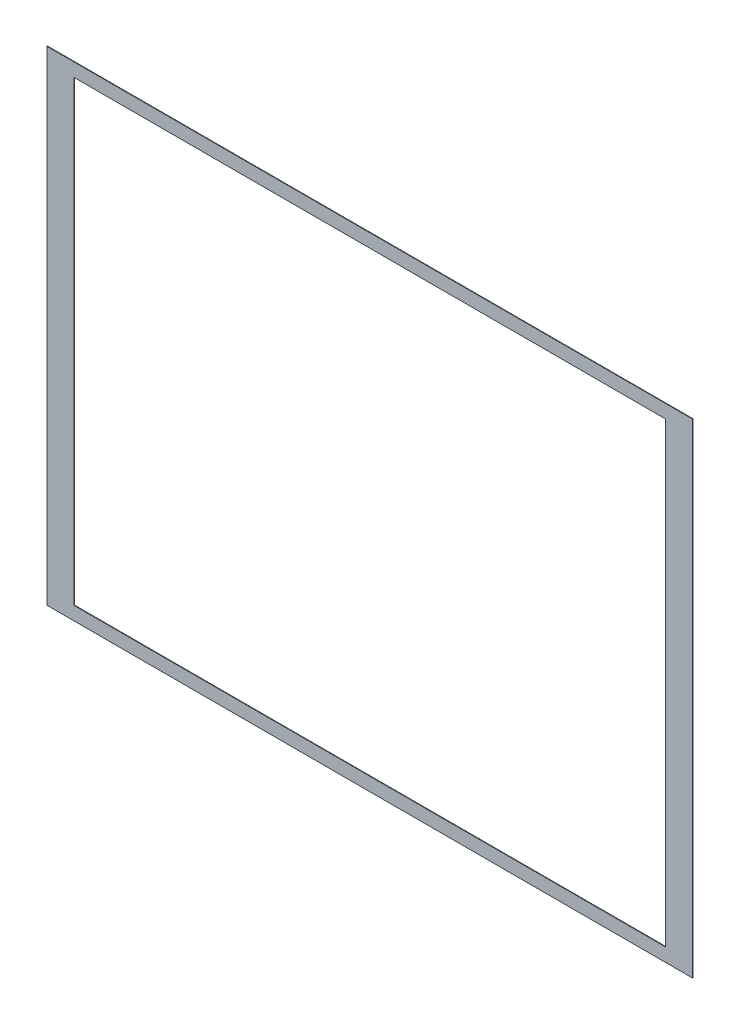
ISO-10303-21;
HEADER;
FILE_DESCRIPTION(('STEP AP214'),'2;1');
FILE_NAME('part.step','',(''),(''),'','','');
FILE_SCHEMA(('AUTOMOTIVE_DESIGN { 1 0 10303 214 1 1 1 1 }'));
ENDSEC;
DATA;
#1=APPLICATION_CONTEXT('core data for automotive mechanical design processes');
#2=APPLICATION_PROTOCOL_DEFINITION('international standard','automotive_design',2000,#1);
#3=PRODUCT_CONTEXT('',#1,'mechanical');
#4=PRODUCT('Part','Part','',(#3));
#5=PRODUCT_RELATED_PRODUCT_CATEGORY('part','',(#4));
#6=PRODUCT_DEFINITION_FORMATION('','',#4);
#7=PRODUCT_DEFINITION_CONTEXT('part definition',#1,'design');
#8=PRODUCT_DEFINITION('design','',#6,#7);
#9=PRODUCT_DEFINITION_SHAPE('','',#8);
#10=(LENGTH_UNIT() NAMED_UNIT(*) SI_UNIT(.MILLI.,.METRE.));
#11=(NAMED_UNIT(*) PLANE_ANGLE_UNIT() SI_UNIT($,.RADIAN.));
#12=(NAMED_UNIT(*) SI_UNIT($,.STERADIAN.) SOLID_ANGLE_UNIT());
#13=UNCERTAINTY_MEASURE_WITH_UNIT(LENGTH_MEASURE(1.E-05),#10,'distance_accuracy_value','');
#14=(GEOMETRIC_REPRESENTATION_CONTEXT(3) GLOBAL_UNCERTAINTY_ASSIGNED_CONTEXT((#13)) GLOBAL_UNIT_ASSIGNED_CONTEXT((#10,
#11,#12)) REPRESENTATION_CONTEXT('',''));
#15=CARTESIAN_POINT('',(0.,0.,0.));
#16=DIRECTION('',(0.,0.,1.));
#17=DIRECTION('',(1.,0.,0.));
#18=AXIS2_PLACEMENT_3D('',#15,#16,#17);
#19=CARTESIAN_POINT('',(0.,0.,0.254));
#20=DIRECTION('',(0.,0.,1.));
#21=DIRECTION('',(1.,0.,0.));
#22=AXIS2_PLACEMENT_3D('',#19,#20,#21);
#23=PLANE('',#22);
#24=DIRECTION('',(0.,1.,0.));
#25=VECTOR('',#24,1.);
#26=CARTESIAN_POINT('',(152.4,-114.3,0.253999999999976));
#27=LINE('',#26,#25);
#28=CARTESIAN_POINT('',(152.4,114.3,0.253999999999982));
#29=VERTEX_POINT('',#28);
#30=CARTESIAN_POINT('',(152.4,-114.3,0.253999999999982));
#31=VERTEX_POINT('',#30);
#32=EDGE_CURVE('E94',#29,#31,#27,.F.);
#33=ORIENTED_EDGE('',*,*,#32,.F.);
#34=DIRECTION('',(1.,0.,0.));
#35=VECTOR('',#34,1.);
#36=CARTESIAN_POINT('',(152.4,114.3,0.253999999999976));
#37=LINE('',#36,#35);
#38=CARTESIAN_POINT('',(-152.4,114.3,0.253999999999982));
#39=VERTEX_POINT('',#38);
#40=EDGE_CURVE('E80',#39,#29,#37,.T.);
#41=ORIENTED_EDGE('',*,*,#40,.F.);
#42=DIRECTION('',(0.,1.,0.));
#43=VECTOR('',#42,1.);
#44=CARTESIAN_POINT('',(-152.4,-114.3,0.253999999999976));
#45=LINE('',#44,#43);
#46=CARTESIAN_POINT('',(-152.4,-114.3,0.253999999999982));
#47=VERTEX_POINT('',#46);
#48=EDGE_CURVE('E20',#47,#39,#45,.T.);
#49=ORIENTED_EDGE('',*,*,#48,.F.);
#50=DIRECTION('',(1.,0.,0.));
#51=VECTOR('',#50,1.);
#52=CARTESIAN_POINT('',(152.4,-114.3,0.253999999999976));
#53=LINE('',#52,#51);
#54=EDGE_CURVE('E109',#31,#47,#53,.F.);
#55=ORIENTED_EDGE('',*,*,#54,.F.);
#56=EDGE_LOOP('',(#33,#41,#49,#55));
#57=FACE_BOUND('',#56,.T.);
#58=DIRECTION('',(1.,0.,0.));
#59=VECTOR('',#58,1.);
#60=CARTESIAN_POINT('',(139.7,107.95,0.253999999999976));
#61=LINE('',#60,#59);
#62=CARTESIAN_POINT('',(-139.7,107.95,0.253999999999982));
#63=VERTEX_POINT('',#62);
#64=CARTESIAN_POINT('',(139.7,107.95,0.253999999999988));
#65=VERTEX_POINT('',#64);
#66=EDGE_CURVE('E124',#63,#65,#61,.T.);
#67=ORIENTED_EDGE('',*,*,#66,.T.);
#68=DIRECTION('',(0.,1.,0.));
#69=VECTOR('',#68,1.);
#70=CARTESIAN_POINT('',(139.7,-107.95,0.253999999999976));
#71=LINE('',#70,#69);
#72=CARTESIAN_POINT('',(139.7,-107.95,0.253999999999988));
#73=VERTEX_POINT('',#72);
#74=EDGE_CURVE('E117',#65,#73,#71,.F.);
#75=ORIENTED_EDGE('',*,*,#74,.T.);
#76=DIRECTION('',(1.,0.,0.));
#77=VECTOR('',#76,1.);
#78=CARTESIAN_POINT('',(-139.7,-107.95,0.253999999999976));
#79=LINE('',#78,#77);
#80=CARTESIAN_POINT('',(-139.7,-107.95,0.253999999999988));
#81=VERTEX_POINT('',#80);
#82=EDGE_CURVE('E113',#73,#81,#79,.F.);
#83=ORIENTED_EDGE('',*,*,#82,.T.);
#84=DIRECTION('',(0.,1.,0.));
#85=VECTOR('',#84,1.);
#86=CARTESIAN_POINT('',(-139.7,107.95,0.253999999999976));
#87=LINE('',#86,#85);
#88=EDGE_CURVE('E111',#81,#63,#87,.T.);
#89=ORIENTED_EDGE('',*,*,#88,.T.);
#90=EDGE_LOOP('',(#67,#75,#83,#89));
#91=FACE_BOUND('',#90,.T.);
#92=ADVANCED_FACE('F17',(#57,#91),#23,.T.);
#93=CARTESIAN_POINT('',(-152.4,-114.3,-381.));
#94=DIRECTION('',(-1.,0.,0.));
#95=DIRECTION('',(0.,0.,1.));
#96=AXIS2_PLACEMENT_3D('',#93,#94,#95);
#97=PLANE('',#96);
#98=DIRECTION('',(0.,0.,-1.));
#99=VECTOR('',#98,1.);
#100=CARTESIAN_POINT('',(-152.4,-114.3,-381.));
#101=LINE('',#100,#99);
#102=CARTESIAN_POINT('',(-152.4,-114.3,0.));
#103=VERTEX_POINT('',#102);
#104=EDGE_CURVE('E89',#47,#103,#101,.T.);
#105=ORIENTED_EDGE('',*,*,#104,.F.);
#106=ORIENTED_EDGE('',*,*,#48,.T.);
#107=DIRECTION('',(0.,0.,1.));
#108=VECTOR('',#107,1.);
#109=CARTESIAN_POINT('',(-152.4,114.3,-381.));
#110=LINE('',#109,#108);
#111=CARTESIAN_POINT('',(-152.4,114.3,0.));
#112=VERTEX_POINT('',#111);
#113=EDGE_CURVE('E86',#112,#39,#110,.T.);
#114=ORIENTED_EDGE('',*,*,#113,.F.);
#115=DIRECTION('',(0.,1.,0.));
#116=VECTOR('',#115,1.);
#117=CARTESIAN_POINT('',(-152.4,0.,0.));
#118=LINE('',#117,#116);
#119=EDGE_CURVE('E127',#103,#112,#118,.T.);
#120=ORIENTED_EDGE('',*,*,#119,.F.);
#121=EDGE_LOOP('',(#105,#106,#114,#120));
#122=FACE_BOUND('',#121,.T.);
#123=ADVANCED_FACE('F85',(#122),#97,.T.);
#124=CARTESIAN_POINT('',(152.4,114.3,-381.));
#125=DIRECTION('',(0.,1.,0.));
#126=DIRECTION('',(0.,0.,1.));
#127=AXIS2_PLACEMENT_3D('',#124,#125,#126);
#128=PLANE('',#127);
#129=ORIENTED_EDGE('',*,*,#113,.T.);
#130=ORIENTED_EDGE('',*,*,#40,.T.);
#131=DIRECTION('',(0.,0.,-1.));
#132=VECTOR('',#131,1.);
#133=CARTESIAN_POINT('',(152.4,114.3,-381.));
#134=LINE('',#133,#132);
#135=CARTESIAN_POINT('',(152.4,114.3,0.));
#136=VERTEX_POINT('',#135);
#137=EDGE_CURVE('E96',#136,#29,#134,.F.);
#138=ORIENTED_EDGE('',*,*,#137,.F.);
#139=DIRECTION('',(-1.,0.,0.));
#140=VECTOR('',#139,1.);
#141=CARTESIAN_POINT('',(0.,114.3,0.));
#142=LINE('',#141,#140);
#143=EDGE_CURVE('E100',#112,#136,#142,.F.);
#144=ORIENTED_EDGE('',*,*,#143,.F.);
#145=EDGE_LOOP('',(#129,#130,#138,#144));
#146=FACE_BOUND('',#145,.T.);
#147=ADVANCED_FACE('F98',(#146),#128,.T.);
#148=CARTESIAN_POINT('',(152.4,-114.3,-381.));
#149=DIRECTION('',(1.,0.,0.));
#150=DIRECTION('',(0.,0.,-1.));
#151=AXIS2_PLACEMENT_3D('',#148,#149,#150);
#152=PLANE('',#151);
#153=ORIENTED_EDGE('',*,*,#137,.T.);
#154=ORIENTED_EDGE('',*,*,#32,.T.);
#155=DIRECTION('',(0.,0.,-1.));
#156=VECTOR('',#155,1.);
#157=CARTESIAN_POINT('',(152.4,-114.3,-381.));
#158=LINE('',#157,#156);
#159=CARTESIAN_POINT('',(152.4,-114.3,0.));
#160=VERTEX_POINT('',#159);
#161=EDGE_CURVE('E106',#160,#31,#158,.F.);
#162=ORIENTED_EDGE('',*,*,#161,.F.);
#163=DIRECTION('',(0.,1.,0.));
#164=VECTOR('',#163,1.);
#165=CARTESIAN_POINT('',(152.4,0.,0.));
#166=LINE('',#165,#164);
#167=EDGE_CURVE('E130',#136,#160,#166,.F.);
#168=ORIENTED_EDGE('',*,*,#167,.F.);
#169=EDGE_LOOP('',(#153,#154,#162,#168));
#170=FACE_BOUND('',#169,.T.);
#171=ADVANCED_FACE('F177',(#170),#152,.T.);
#172=CARTESIAN_POINT('',(152.4,-114.3,-381.));
#173=DIRECTION('',(0.,-1.,0.));
#174=DIRECTION('',(0.,0.,-1.));
#175=AXIS2_PLACEMENT_3D('',#172,#173,#174);
#176=PLANE('',#175);
#177=ORIENTED_EDGE('',*,*,#161,.T.);
#178=ORIENTED_EDGE('',*,*,#54,.T.);
#179=ORIENTED_EDGE('',*,*,#104,.T.);
#180=DIRECTION('',(-1.,0.,0.));
#181=VECTOR('',#180,1.);
#182=CARTESIAN_POINT('',(0.,-114.3,0.));
#183=LINE('',#182,#181);
#184=EDGE_CURVE('E133',#160,#103,#183,.T.);
#185=ORIENTED_EDGE('',*,*,#184,.F.);
#186=EDGE_LOOP('',(#177,#178,#179,#185));
#187=FACE_BOUND('',#186,.T.);
#188=ADVANCED_FACE('F174',(#187),#176,.T.);
#189=CARTESIAN_POINT('',(-139.7,107.95,-381.));
#190=DIRECTION('',(-1.,0.,0.));
#191=DIRECTION('',(0.,0.,1.));
#192=AXIS2_PLACEMENT_3D('',#189,#190,#191);
#193=PLANE('',#192);
#194=DIRECTION('',(0.,0.,1.));
#195=VECTOR('',#194,1.);
#196=CARTESIAN_POINT('',(-139.7,107.95,-381.));
#197=LINE('',#196,#195);
#198=CARTESIAN_POINT('',(-139.7,107.95,0.));
#199=VERTEX_POINT('',#198);
#200=EDGE_CURVE('E121',#199,#63,#197,.T.);
#201=ORIENTED_EDGE('',*,*,#200,.T.);
#202=ORIENTED_EDGE('',*,*,#88,.F.);
#203=DIRECTION('',(0.,0.,-1.));
#204=VECTOR('',#203,1.);
#205=CARTESIAN_POINT('',(-139.7,-107.95,-381.));
#206=LINE('',#205,#204);
#207=CARTESIAN_POINT('',(-139.7,-107.95,0.));
#208=VERTEX_POINT('',#207);
#209=EDGE_CURVE('E115',#81,#208,#206,.T.);
#210=ORIENTED_EDGE('',*,*,#209,.T.);
#211=DIRECTION('',(0.,1.,0.));
#212=VECTOR('',#211,1.);
#213=CARTESIAN_POINT('',(-139.7,0.,0.));
#214=LINE('',#213,#212);
#215=EDGE_CURVE('E136',#199,#208,#214,.F.);
#216=ORIENTED_EDGE('',*,*,#215,.F.);
#217=EDGE_LOOP('',(#201,#202,#210,#216));
#218=FACE_BOUND('',#217,.T.);
#219=ADVANCED_FACE('F155',(#218),#193,.F.);
#220=CARTESIAN_POINT('',(-139.7,-107.95,-381.));
#221=DIRECTION('',(0.,-1.,0.));
#222=DIRECTION('',(0.,0.,-1.));
#223=AXIS2_PLACEMENT_3D('',#220,#221,#222);
#224=PLANE('',#223);
#225=ORIENTED_EDGE('',*,*,#209,.F.);
#226=ORIENTED_EDGE('',*,*,#82,.F.);
#227=DIRECTION('',(0.,0.,-1.));
#228=VECTOR('',#227,1.);
#229=CARTESIAN_POINT('',(139.7,-107.95,-381.));
#230=LINE('',#229,#228);
#231=CARTESIAN_POINT('',(139.7,-107.95,0.));
#232=VERTEX_POINT('',#231);
#233=EDGE_CURVE('E119',#73,#232,#230,.T.);
#234=ORIENTED_EDGE('',*,*,#233,.T.);
#235=DIRECTION('',(-1.,0.,0.));
#236=VECTOR('',#235,1.);
#237=CARTESIAN_POINT('',(0.,-107.95,0.));
#238=LINE('',#237,#236);
#239=EDGE_CURVE('E139',#208,#232,#238,.F.);
#240=ORIENTED_EDGE('',*,*,#239,.F.);
#241=EDGE_LOOP('',(#225,#226,#234,#240));
#242=FACE_BOUND('',#241,.T.);
#243=ADVANCED_FACE('F152',(#242),#224,.F.);
#244=CARTESIAN_POINT('',(139.7,-107.95,-381.));
#245=DIRECTION('',(1.,0.,0.));
#246=DIRECTION('',(0.,0.,-1.));
#247=AXIS2_PLACEMENT_3D('',#244,#245,#246);
#248=PLANE('',#247);
#249=ORIENTED_EDGE('',*,*,#233,.F.);
#250=ORIENTED_EDGE('',*,*,#74,.F.);
#251=DIRECTION('',(0.,0.,1.));
#252=VECTOR('',#251,1.);
#253=CARTESIAN_POINT('',(139.7,107.95,-381.));
#254=LINE('',#253,#252);
#255=CARTESIAN_POINT('',(139.7,107.95,0.));
#256=VERTEX_POINT('',#255);
#257=EDGE_CURVE('E35',#65,#256,#254,.F.);
#258=ORIENTED_EDGE('',*,*,#257,.T.);
#259=DIRECTION('',(0.,1.,0.));
#260=VECTOR('',#259,1.);
#261=CARTESIAN_POINT('',(139.7,0.,0.));
#262=LINE('',#261,#260);
#263=EDGE_CURVE('E26',#232,#256,#262,.T.);
#264=ORIENTED_EDGE('',*,*,#263,.F.);
#265=EDGE_LOOP('',(#249,#250,#258,#264));
#266=FACE_BOUND('',#265,.T.);
#267=ADVANCED_FACE('F148',(#266),#248,.F.);
#268=CARTESIAN_POINT('',(139.7,107.95,-381.));
#269=DIRECTION('',(0.,1.,0.));
#270=DIRECTION('',(0.,0.,1.));
#271=AXIS2_PLACEMENT_3D('',#268,#269,#270);
#272=PLANE('',#271);
#273=ORIENTED_EDGE('',*,*,#257,.F.);
#274=ORIENTED_EDGE('',*,*,#66,.F.);
#275=ORIENTED_EDGE('',*,*,#200,.F.);
#276=DIRECTION('',(-1.,0.,0.));
#277=VECTOR('',#276,1.);
#278=CARTESIAN_POINT('',(0.,107.95,0.));
#279=LINE('',#278,#277);
#280=EDGE_CURVE('E11',#256,#199,#279,.T.);
#281=ORIENTED_EDGE('',*,*,#280,.F.);
#282=EDGE_LOOP('',(#273,#274,#275,#281));
#283=FACE_BOUND('',#282,.T.);
#284=ADVANCED_FACE('F159',(#283),#272,.F.);
#285=CARTESIAN_POINT('',(0.,0.,0.));
#286=DIRECTION('',(0.,0.,-1.));
#287=DIRECTION('',(-1.,0.,0.));
#288=AXIS2_PLACEMENT_3D('',#285,#286,#287);
#289=PLANE('',#288);
#290=ORIENTED_EDGE('',*,*,#263,.T.);
#291=ORIENTED_EDGE('',*,*,#280,.T.);
#292=ORIENTED_EDGE('',*,*,#215,.T.);
#293=ORIENTED_EDGE('',*,*,#239,.T.);
#294=EDGE_LOOP('',(#290,#291,#292,#293));
#295=FACE_BOUND('',#294,.T.);
#296=ORIENTED_EDGE('',*,*,#167,.T.);
#297=ORIENTED_EDGE('',*,*,#184,.T.);
#298=ORIENTED_EDGE('',*,*,#119,.T.);
#299=ORIENTED_EDGE('',*,*,#143,.T.);
#300=EDGE_LOOP('',(#296,#297,#298,#299));
#301=FACE_BOUND('',#300,.T.);
#302=ADVANCED_FACE('F144',(#295,#301),#289,.T.);
#303=CLOSED_SHELL('',(#92,#123,#147,#171,#188,#219,#243,#267,#284,#302));
#304=MANIFOLD_SOLID_BREP('B1',#303);
#305=ADVANCED_BREP_SHAPE_REPRESENTATION('',(#18,#304),#14);
#306=SHAPE_DEFINITION_REPRESENTATION(#9,#305);
ENDSEC;
END-ISO-10303-21;
